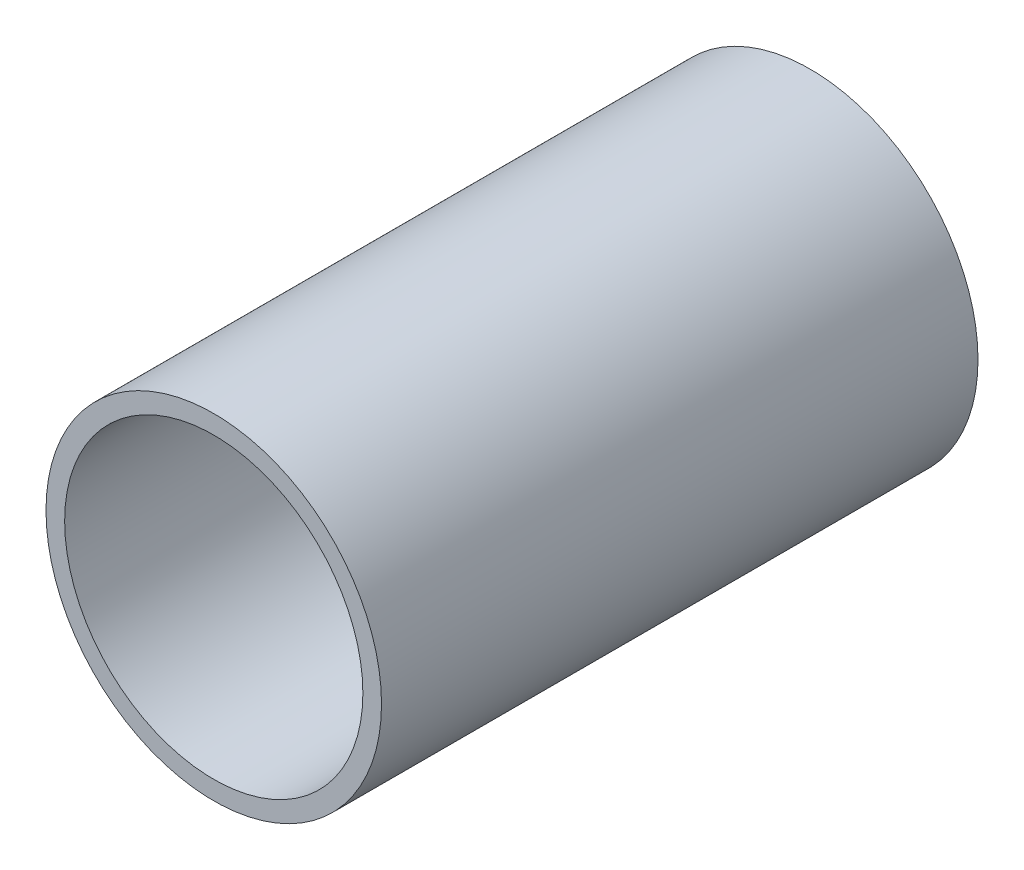
ISO-10303-21;
HEADER;
FILE_DESCRIPTION(('STEP AP214'),'2;1');
FILE_NAME('part.step','',(''),(''),'','','');
FILE_SCHEMA(('AUTOMOTIVE_DESIGN { 1 0 10303 214 1 1 1 1 }'));
ENDSEC;
DATA;
#1=APPLICATION_CONTEXT('core data for automotive mechanical design processes');
#2=APPLICATION_PROTOCOL_DEFINITION('international standard','automotive_design',2000,#1);
#3=PRODUCT_CONTEXT('',#1,'mechanical');
#4=PRODUCT('Part','Part','',(#3));
#5=PRODUCT_RELATED_PRODUCT_CATEGORY('part','',(#4));
#6=PRODUCT_DEFINITION_FORMATION('','',#4);
#7=PRODUCT_DEFINITION_CONTEXT('part definition',#1,'design');
#8=PRODUCT_DEFINITION('design','',#6,#7);
#9=PRODUCT_DEFINITION_SHAPE('','',#8);
#10=(LENGTH_UNIT() NAMED_UNIT(*) SI_UNIT(.MILLI.,.METRE.));
#11=(NAMED_UNIT(*) PLANE_ANGLE_UNIT() SI_UNIT($,.RADIAN.));
#12=(NAMED_UNIT(*) SI_UNIT($,.STERADIAN.) SOLID_ANGLE_UNIT());
#13=UNCERTAINTY_MEASURE_WITH_UNIT(LENGTH_MEASURE(1.E-05),#10,'distance_accuracy_value','');
#14=(GEOMETRIC_REPRESENTATION_CONTEXT(3) GLOBAL_UNCERTAINTY_ASSIGNED_CONTEXT((#13)) GLOBAL_UNIT_ASSIGNED_CONTEXT((#10,
#11,#12)) REPRESENTATION_CONTEXT('',''));
#15=CARTESIAN_POINT('',(0.,0.,0.));
#16=DIRECTION('',(0.,0.,1.));
#17=DIRECTION('',(1.,0.,0.));
#18=AXIS2_PLACEMENT_3D('',#15,#16,#17);
#19=CARTESIAN_POINT('',(0.,0.,101.6));
#20=DIRECTION('',(0.,0.,1.));
#21=DIRECTION('',(1.,0.,0.));
#22=AXIS2_PLACEMENT_3D('',#19,#20,#21);
#23=PLANE('',#22);
#24=CARTESIAN_POINT('',(0.,0.,101.6));
#25=DIRECTION('',(0.,0.,1.));
#26=DIRECTION('',(1.,0.,0.));
#27=AXIS2_PLACEMENT_3D('',#24,#25,#26);
#28=CIRCLE('',#27,57.15);
#29=CARTESIAN_POINT('',(57.15,0.,101.6));
#30=VERTEX_POINT('',#29);
#31=EDGE_CURVE('E10',#30,#30,#28,.T.);
#32=ORIENTED_EDGE('',*,*,#31,.T.);
#33=EDGE_LOOP('',(#32));
#34=FACE_BOUND('',#33,.T.);
#35=CARTESIAN_POINT('',(0.,0.,101.6));
#36=DIRECTION('',(0.,0.,1.));
#37=DIRECTION('',(1.,0.,0.));
#38=AXIS2_PLACEMENT_3D('',#35,#36,#37);
#39=CIRCLE('',#38,50.8);
#40=CARTESIAN_POINT('',(50.8,0.,101.6));
#41=VERTEX_POINT('',#40);
#42=EDGE_CURVE('E42',#41,#41,#39,.T.);
#43=ORIENTED_EDGE('',*,*,#42,.F.);
#44=EDGE_LOOP('',(#43));
#45=FACE_BOUND('',#44,.T.);
#46=ADVANCED_FACE('F31',(#34,#45),#23,.T.);
#47=CARTESIAN_POINT('',(0.,0.,-101.6));
#48=DIRECTION('',(0.,0.,1.));
#49=DIRECTION('',(1.,0.,0.));
#50=AXIS2_PLACEMENT_3D('',#47,#48,#49);
#51=PLANE('',#50);
#52=CARTESIAN_POINT('',(0.,0.,-101.6));
#53=DIRECTION('',(0.,0.,1.));
#54=DIRECTION('',(1.,0.,0.));
#55=AXIS2_PLACEMENT_3D('',#52,#53,#54);
#56=CIRCLE('',#55,57.15);
#57=CARTESIAN_POINT('',(57.15,0.,-101.6));
#58=VERTEX_POINT('',#57);
#59=EDGE_CURVE('E35',#58,#58,#56,.T.);
#60=ORIENTED_EDGE('',*,*,#59,.F.);
#61=EDGE_LOOP('',(#60));
#62=FACE_BOUND('',#61,.T.);
#63=CARTESIAN_POINT('',(0.,0.,-101.6));
#64=DIRECTION('',(0.,0.,1.));
#65=DIRECTION('',(1.,0.,0.));
#66=AXIS2_PLACEMENT_3D('',#63,#64,#65);
#67=CIRCLE('',#66,50.8);
#68=CARTESIAN_POINT('',(50.8,0.,-101.6));
#69=VERTEX_POINT('',#68);
#70=EDGE_CURVE('E44',#69,#69,#67,.T.);
#71=ORIENTED_EDGE('',*,*,#70,.T.);
#72=EDGE_LOOP('',(#71));
#73=FACE_BOUND('',#72,.T.);
#74=ADVANCED_FACE('F54',(#62,#73),#51,.F.);
#75=CARTESIAN_POINT('',(0.,0.,101.6));
#76=DIRECTION('',(0.,0.,-1.));
#77=DIRECTION('',(-1.,0.,0.));
#78=AXIS2_PLACEMENT_3D('',#75,#76,#77);
#79=CYLINDRICAL_SURFACE('',#78,57.15);
#80=ORIENTED_EDGE('',*,*,#31,.F.);
#81=EDGE_LOOP('',(#80));
#82=FACE_BOUND('',#81,.T.);
#83=ORIENTED_EDGE('',*,*,#59,.T.);
#84=EDGE_LOOP('',(#83));
#85=FACE_BOUND('',#84,.T.);
#86=ADVANCED_FACE('F33',(#82,#85),#79,.T.);
#87=CARTESIAN_POINT('',(0.,0.,101.6));
#88=DIRECTION('',(0.,0.,-1.));
#89=DIRECTION('',(-1.,0.,0.));
#90=AXIS2_PLACEMENT_3D('',#87,#88,#89);
#91=CYLINDRICAL_SURFACE('',#90,50.8);
#92=ORIENTED_EDGE('',*,*,#42,.T.);
#93=EDGE_LOOP('',(#92));
#94=FACE_BOUND('',#93,.T.);
#95=ORIENTED_EDGE('',*,*,#70,.F.);
#96=EDGE_LOOP('',(#95));
#97=FACE_BOUND('',#96,.T.);
#98=ADVANCED_FACE('F50',(#94,#97),#91,.F.);
#99=CLOSED_SHELL('',(#46,#74,#86,#98));
#100=MANIFOLD_SOLID_BREP('B2',#99);
#101=ADVANCED_BREP_SHAPE_REPRESENTATION('',(#18,#100),#14);
#102=SHAPE_DEFINITION_REPRESENTATION(#9,#101);
ENDSEC;
END-ISO-10303-21;
